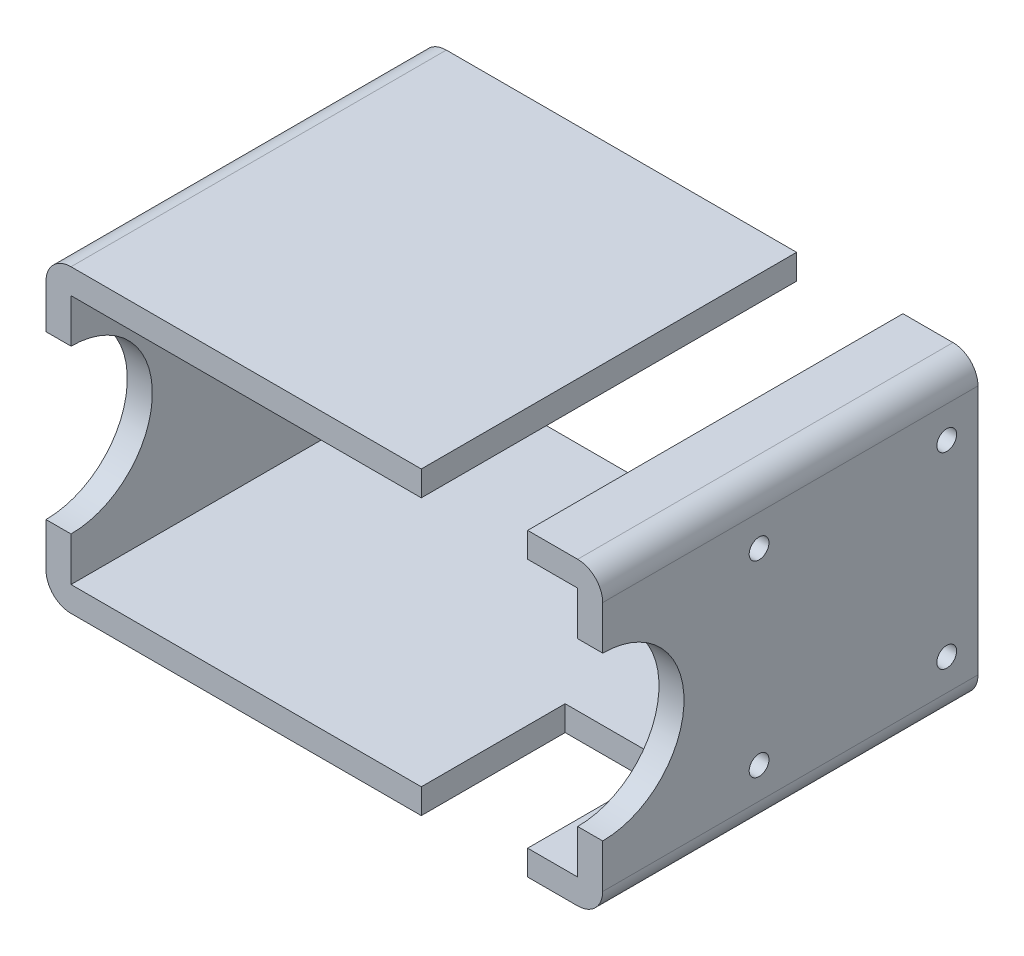
ISO-10303-21;
HEADER;
FILE_DESCRIPTION(('STEP AP214'),'2;1');
FILE_NAME('part.step','',(''),(''),'','','');
FILE_SCHEMA(('AUTOMOTIVE_DESIGN { 1 0 10303 214 1 1 1 1 }'));
ENDSEC;
DATA;
#1=APPLICATION_CONTEXT('core data for automotive mechanical design processes');
#2=APPLICATION_PROTOCOL_DEFINITION('international standard','automotive_design',2000,#1);
#3=PRODUCT_CONTEXT('',#1,'mechanical');
#4=PRODUCT('Part','Part','',(#3));
#5=PRODUCT_RELATED_PRODUCT_CATEGORY('part','',(#4));
#6=PRODUCT_DEFINITION_FORMATION('','',#4);
#7=PRODUCT_DEFINITION_CONTEXT('part definition',#1,'design');
#8=PRODUCT_DEFINITION('design','',#6,#7);
#9=PRODUCT_DEFINITION_SHAPE('','',#8);
#10=(LENGTH_UNIT() NAMED_UNIT(*) SI_UNIT(.MILLI.,.METRE.));
#11=(NAMED_UNIT(*) PLANE_ANGLE_UNIT() SI_UNIT($,.RADIAN.));
#12=(NAMED_UNIT(*) SI_UNIT($,.STERADIAN.) SOLID_ANGLE_UNIT());
#13=UNCERTAINTY_MEASURE_WITH_UNIT(LENGTH_MEASURE(1.E-05),#10,'distance_accuracy_value','');
#14=(GEOMETRIC_REPRESENTATION_CONTEXT(3) GLOBAL_UNCERTAINTY_ASSIGNED_CONTEXT((#13)) GLOBAL_UNIT_ASSIGNED_CONTEXT((#10,
#11,#12)) REPRESENTATION_CONTEXT('',''));
#15=CARTESIAN_POINT('',(0.,0.,0.));
#16=DIRECTION('',(0.,0.,1.));
#17=DIRECTION('',(1.,0.,0.));
#18=AXIS2_PLACEMENT_3D('',#15,#16,#17);
#19=CARTESIAN_POINT('',(40.5,20.,42.));
#20=DIRECTION('',(0.,1.,0.));
#21=DIRECTION('',(0.,0.,-1.));
#22=AXIS2_PLACEMENT_3D('',#19,#20,#21);
#23=PLANE('',#22);
#24=DIRECTION('',(0.,0.,-1.));
#25=VECTOR('',#24,1.);
#26=CARTESIAN_POINT('',(36.5,20.,42.));
#27=LINE('',#26,#25);
#28=CARTESIAN_POINT('',(36.5,20.,42.));
#29=VERTEX_POINT('',#28);
#30=CARTESIAN_POINT('',(36.5,20.,12.));
#31=VERTEX_POINT('',#30);
#32=EDGE_CURVE('E180',#29,#31,#27,.T.);
#33=ORIENTED_EDGE('',*,*,#32,.T.);
#34=DIRECTION('',(-1.,0.,0.));
#35=VECTOR('',#34,1.);
#36=CARTESIAN_POINT('',(40.5,20.,12.));
#37=LINE('',#36,#35);
#38=CARTESIAN_POINT('',(40.5,20.,12.));
#39=VERTEX_POINT('',#38);
#40=EDGE_CURVE('E183',#39,#31,#37,.T.);
#41=ORIENTED_EDGE('',*,*,#40,.F.);
#42=DIRECTION('',(0.,0.,-1.));
#43=VECTOR('',#42,1.);
#44=CARTESIAN_POINT('',(40.5,20.,42.));
#45=LINE('',#44,#43);
#46=CARTESIAN_POINT('',(40.5,20.,42.));
#47=VERTEX_POINT('',#46);
#48=EDGE_CURVE('E214',#47,#39,#45,.T.);
#49=ORIENTED_EDGE('',*,*,#48,.F.);
#50=DIRECTION('',(-1.,0.,0.));
#51=VECTOR('',#50,1.);
#52=CARTESIAN_POINT('',(40.5,20.,42.));
#53=LINE('',#52,#51);
#54=EDGE_CURVE('E185',#47,#29,#53,.T.);
#55=ORIENTED_EDGE('',*,*,#54,.T.);
#56=EDGE_LOOP('',(#33,#41,#49,#55));
#57=FACE_BOUND('',#56,.T.);
#58=ADVANCED_FACE('F17',(#57),#23,.F.);
#59=CARTESIAN_POINT('',(42.5,22.,42.));
#60=DIRECTION('',(0.,1.,0.));
#61=DIRECTION('',(0.,0.,-1.));
#62=AXIS2_PLACEMENT_3D('',#59,#60,#61);
#63=PLANE('',#62);
#64=DIRECTION('',(-1.,0.,0.));
#65=VECTOR('',#64,1.);
#66=CARTESIAN_POINT('',(42.5,22.,12.));
#67=LINE('',#66,#65);
#68=CARTESIAN_POINT('',(40.5,22.,12.));
#69=VERTEX_POINT('',#68);
#70=CARTESIAN_POINT('',(36.5,22.,12.));
#71=VERTEX_POINT('',#70);
#72=EDGE_CURVE('E300',#69,#71,#67,.T.);
#73=ORIENTED_EDGE('',*,*,#72,.T.);
#74=DIRECTION('',(0.,0.,-1.));
#75=VECTOR('',#74,1.);
#76=CARTESIAN_POINT('',(36.5,22.,42.));
#77=LINE('',#76,#75);
#78=CARTESIAN_POINT('',(36.5,22.,42.));
#79=VERTEX_POINT('',#78);
#80=EDGE_CURVE('E40',#79,#71,#77,.T.);
#81=ORIENTED_EDGE('',*,*,#80,.F.);
#82=DIRECTION('',(-1.,0.,0.));
#83=VECTOR('',#82,1.);
#84=CARTESIAN_POINT('',(42.5,22.,42.));
#85=LINE('',#84,#83);
#86=CARTESIAN_POINT('',(40.5,22.,42.));
#87=VERTEX_POINT('',#86);
#88=EDGE_CURVE('E268',#87,#79,#85,.T.);
#89=ORIENTED_EDGE('',*,*,#88,.F.);
#90=DIRECTION('',(0.,0.,-1.));
#91=VECTOR('',#90,1.);
#92=CARTESIAN_POINT('',(40.5,22.,42.));
#93=LINE('',#92,#91);
#94=EDGE_CURVE('E357',#87,#69,#93,.T.);
#95=ORIENTED_EDGE('',*,*,#94,.T.);
#96=EDGE_LOOP('',(#73,#81,#89,#95));
#97=FACE_BOUND('',#96,.T.);
#98=ADVANCED_FACE('F674',(#97),#63,.T.);
#99=CARTESIAN_POINT('',(0.,0.,12.));
#100=DIRECTION('',(0.,0.,-1.));
#101=DIRECTION('',(1.,0.,0.));
#102=AXIS2_PLACEMENT_3D('',#99,#100,#101);
#103=PLANE('',#102);
#104=CARTESIAN_POINT('',(28.,22.,12.));
#105=VERTEX_POINT('',#104);
#106=CARTESIAN_POINT('',(0.,22.,12.));
#107=VERTEX_POINT('',#106);
#108=EDGE_CURVE('E299',#105,#107,#67,.T.);
#109=ORIENTED_EDGE('',*,*,#108,.F.);
#110=DIRECTION('',(0.,-1.,0.));
#111=VECTOR('',#110,1.);
#112=CARTESIAN_POINT('',(28.,0.,12.));
#113=LINE('',#112,#111);
#114=CARTESIAN_POINT('',(28.,20.,12.));
#115=VERTEX_POINT('',#114);
#116=EDGE_CURVE('E11',#105,#115,#113,.T.);
#117=ORIENTED_EDGE('',*,*,#116,.T.);
#118=CARTESIAN_POINT('',(0.,20.,12.));
#119=VERTEX_POINT('',#118);
#120=EDGE_CURVE('E202',#115,#119,#37,.T.);
#121=ORIENTED_EDGE('',*,*,#120,.T.);
#122=DIRECTION('',(0.,-1.,0.));
#123=VECTOR('',#122,1.);
#124=CARTESIAN_POINT('',(0.,20.,12.));
#125=LINE('',#124,#123);
#126=CARTESIAN_POINT('',(0.,0.,12.));
#127=VERTEX_POINT('',#126);
#128=EDGE_CURVE('E211',#119,#127,#125,.T.);
#129=ORIENTED_EDGE('',*,*,#128,.T.);
#130=DIRECTION('',(1.,0.,0.));
#131=VECTOR('',#130,1.);
#132=CARTESIAN_POINT('',(0.,0.,12.));
#133=LINE('',#132,#131);
#134=CARTESIAN_POINT('',(40.5,0.,12.));
#135=VERTEX_POINT('',#134);
#136=EDGE_CURVE('E208',#127,#135,#133,.T.);
#137=ORIENTED_EDGE('',*,*,#136,.T.);
#138=DIRECTION('',(0.,1.,0.));
#139=VECTOR('',#138,1.);
#140=CARTESIAN_POINT('',(40.5,0.,12.));
#141=LINE('',#140,#139);
#142=EDGE_CURVE('E199',#135,#39,#141,.T.);
#143=ORIENTED_EDGE('',*,*,#142,.T.);
#144=ORIENTED_EDGE('',*,*,#40,.T.);
#145=DIRECTION('',(0.,1.,0.));
#146=VECTOR('',#145,1.);
#147=CARTESIAN_POINT('',(36.5,0.,12.));
#148=LINE('',#147,#146);
#149=EDGE_CURVE('E26',#31,#71,#148,.T.);
#150=ORIENTED_EDGE('',*,*,#149,.T.);
#151=ORIENTED_EDGE('',*,*,#72,.F.);
#152=CARTESIAN_POINT('',(40.5,20.,12.));
#153=DIRECTION('',(0.,0.,-1.));
#154=DIRECTION('',(-1.,0.,0.));
#155=AXIS2_PLACEMENT_3D('',#152,#153,#154);
#156=CIRCLE('',#155,2.);
#157=CARTESIAN_POINT('',(42.5,20.,12.));
#158=VERTEX_POINT('',#157);
#159=EDGE_CURVE('E344',#69,#158,#156,.T.);
#160=ORIENTED_EDGE('',*,*,#159,.T.);
#161=DIRECTION('',(0.,1.,0.));
#162=VECTOR('',#161,1.);
#163=CARTESIAN_POINT('',(42.5,-2.,12.));
#164=LINE('',#163,#162);
#165=CARTESIAN_POINT('',(42.5,0.,12.));
#166=VERTEX_POINT('',#165);
#167=EDGE_CURVE('E295',#166,#158,#164,.T.);
#168=ORIENTED_EDGE('',*,*,#167,.F.);
#169=CARTESIAN_POINT('',(40.5,0.,12.));
#170=DIRECTION('',(0.,0.,-1.));
#171=DIRECTION('',(-1.,0.,0.));
#172=AXIS2_PLACEMENT_3D('',#169,#170,#171);
#173=CIRCLE('',#172,2.);
#174=CARTESIAN_POINT('',(40.5,-2.,12.));
#175=VERTEX_POINT('',#174);
#176=EDGE_CURVE('E347',#166,#175,#173,.T.);
#177=ORIENTED_EDGE('',*,*,#176,.T.);
#178=DIRECTION('',(1.,0.,0.));
#179=VECTOR('',#178,1.);
#180=CARTESIAN_POINT('',(-2.,-2.,12.));
#181=LINE('',#180,#179);
#182=CARTESIAN_POINT('',(0.,-2.,12.));
#183=VERTEX_POINT('',#182);
#184=EDGE_CURVE('E290',#183,#175,#181,.T.);
#185=ORIENTED_EDGE('',*,*,#184,.F.);
#186=CARTESIAN_POINT('',(0.,0.,12.));
#187=DIRECTION('',(0.,0.,-1.));
#188=DIRECTION('',(-1.,0.,0.));
#189=AXIS2_PLACEMENT_3D('',#186,#187,#188);
#190=CIRCLE('',#189,2.);
#191=CARTESIAN_POINT('',(-2.,0.,12.));
#192=VERTEX_POINT('',#191);
#193=EDGE_CURVE('E350',#183,#192,#190,.T.);
#194=ORIENTED_EDGE('',*,*,#193,.T.);
#195=DIRECTION('',(0.,-1.,0.));
#196=VECTOR('',#195,1.);
#197=CARTESIAN_POINT('',(-2.,22.,12.));
#198=LINE('',#197,#196);
#199=CARTESIAN_POINT('',(-2.,20.,12.));
#200=VERTEX_POINT('',#199);
#201=EDGE_CURVE('E285',#200,#192,#198,.T.);
#202=ORIENTED_EDGE('',*,*,#201,.F.);
#203=CARTESIAN_POINT('',(0.,20.,12.));
#204=DIRECTION('',(0.,0.,-1.));
#205=DIRECTION('',(-1.,0.,0.));
#206=AXIS2_PLACEMENT_3D('',#203,#204,#205);
#207=CIRCLE('',#206,2.);
#208=EDGE_CURVE('E353',#200,#107,#207,.T.);
#209=ORIENTED_EDGE('',*,*,#208,.T.);
#210=EDGE_LOOP('',(#109,#117,#121,#129,#137,#143,#144,#150,#151,#160,#168,#177,#185,#194,#202,#209));
#211=FACE_BOUND('',#210,.T.);
#212=ADVANCED_FACE('F197',(#211),#103,.T.);
#213=CARTESIAN_POINT('',(0.,0.,42.));
#214=DIRECTION('',(0.,0.,-1.));
#215=DIRECTION('',(1.,0.,0.));
#216=AXIS2_PLACEMENT_3D('',#213,#214,#215);
#217=PLANE('',#216);
#218=DIRECTION('',(0.,1.,0.));
#219=VECTOR('',#218,1.);
#220=CARTESIAN_POINT('',(36.5,-2.2,42.));
#221=LINE('',#220,#219);
#222=CARTESIAN_POINT('',(36.5,-2.,42.));
#223=VERTEX_POINT('',#222);
#224=CARTESIAN_POINT('',(36.5,0.,42.));
#225=VERTEX_POINT('',#224);
#226=EDGE_CURVE('E603',#223,#225,#221,.T.);
#227=ORIENTED_EDGE('',*,*,#226,.F.);
#228=DIRECTION('',(1.,0.,0.));
#229=VECTOR('',#228,1.);
#230=CARTESIAN_POINT('',(-2.,-2.,42.));
#231=LINE('',#230,#229);
#232=CARTESIAN_POINT('',(40.5,-2.,42.));
#233=VERTEX_POINT('',#232);
#234=EDGE_CURVE('E320',#223,#233,#231,.T.);
#235=ORIENTED_EDGE('',*,*,#234,.T.);
#236=CARTESIAN_POINT('',(40.5,0.,42.));
#237=DIRECTION('',(0.,0.,-1.));
#238=DIRECTION('',(-1.,0.,0.));
#239=AXIS2_PLACEMENT_3D('',#236,#237,#238);
#240=CIRCLE('',#239,2.);
#241=CARTESIAN_POINT('',(42.5,0.,42.));
#242=VERTEX_POINT('',#241);
#243=EDGE_CURVE('E256',#233,#242,#240,.F.);
#244=ORIENTED_EDGE('',*,*,#243,.T.);
#245=DIRECTION('',(0.,1.,0.));
#246=VECTOR('',#245,1.);
#247=CARTESIAN_POINT('',(42.5,-2.,42.));
#248=LINE('',#247,#246);
#249=CARTESIAN_POINT('',(42.5,3.5,42.));
#250=VERTEX_POINT('',#249);
#251=EDGE_CURVE('E236',#242,#250,#248,.T.);
#252=ORIENTED_EDGE('',*,*,#251,.T.);
#253=DIRECTION('',(1.,0.,0.));
#254=VECTOR('',#253,1.);
#255=CARTESIAN_POINT('',(40.5,3.5,42.));
#256=LINE('',#255,#254);
#257=CARTESIAN_POINT('',(40.5,3.5,42.));
#258=VERTEX_POINT('',#257);
#259=EDGE_CURVE('E291',#258,#250,#256,.T.);
#260=ORIENTED_EDGE('',*,*,#259,.F.);
#261=DIRECTION('',(0.,1.,0.));
#262=VECTOR('',#261,1.);
#263=CARTESIAN_POINT('',(40.5,0.,42.));
#264=LINE('',#263,#262);
#265=CARTESIAN_POINT('',(40.5,0.,42.));
#266=VERTEX_POINT('',#265);
#267=EDGE_CURVE('E238',#266,#258,#264,.T.);
#268=ORIENTED_EDGE('',*,*,#267,.F.);
#269=DIRECTION('',(1.,0.,0.));
#270=VECTOR('',#269,1.);
#271=CARTESIAN_POINT('',(0.,0.,42.));
#272=LINE('',#271,#270);
#273=EDGE_CURVE('E530',#225,#266,#272,.T.);
#274=ORIENTED_EDGE('',*,*,#273,.F.);
#275=EDGE_LOOP('',(#227,#235,#244,#252,#260,#268,#274));
#276=FACE_BOUND('',#275,.T.);
#277=ADVANCED_FACE('F404',(#276),#217,.F.);
#278=DIRECTION('',(0.,-1.,0.));
#279=VECTOR('',#278,1.);
#280=CARTESIAN_POINT('',(28.,22.,42.));
#281=LINE('',#280,#279);
#282=CARTESIAN_POINT('',(28.,22.,42.));
#283=VERTEX_POINT('',#282);
#284=CARTESIAN_POINT('',(28.,20.,42.));
#285=VERTEX_POINT('',#284);
#286=EDGE_CURVE('E501',#283,#285,#281,.T.);
#287=ORIENTED_EDGE('',*,*,#286,.F.);
#288=CARTESIAN_POINT('',(0.,22.,42.));
#289=VERTEX_POINT('',#288);
#290=EDGE_CURVE('E253',#283,#289,#85,.T.);
#291=ORIENTED_EDGE('',*,*,#290,.T.);
#292=CARTESIAN_POINT('',(0.,20.,42.));
#293=DIRECTION('',(0.,0.,-1.));
#294=DIRECTION('',(-1.,0.,0.));
#295=AXIS2_PLACEMENT_3D('',#292,#293,#294);
#296=CIRCLE('',#295,2.);
#297=CARTESIAN_POINT('',(-2.,20.,42.));
#298=VERTEX_POINT('',#297);
#299=EDGE_CURVE('E368',#289,#298,#296,.F.);
#300=ORIENTED_EDGE('',*,*,#299,.T.);
#301=DIRECTION('',(0.,-1.,0.));
#302=VECTOR('',#301,1.);
#303=CARTESIAN_POINT('',(-2.,22.,42.));
#304=LINE('',#303,#302);
#305=CARTESIAN_POINT('',(-2.,16.5,42.));
#306=VERTEX_POINT('',#305);
#307=EDGE_CURVE('E311',#298,#306,#304,.T.);
#308=ORIENTED_EDGE('',*,*,#307,.T.);
#309=DIRECTION('',(1.,0.,0.));
#310=VECTOR('',#309,1.);
#311=CARTESIAN_POINT('',(-2.,16.5,42.));
#312=LINE('',#311,#310);
#313=CARTESIAN_POINT('',(0.,16.5,42.));
#314=VERTEX_POINT('',#313);
#315=EDGE_CURVE('E425',#306,#314,#312,.T.);
#316=ORIENTED_EDGE('',*,*,#315,.T.);
#317=DIRECTION('',(0.,-1.,0.));
#318=VECTOR('',#317,1.);
#319=CARTESIAN_POINT('',(0.,20.,42.));
#320=LINE('',#319,#318);
#321=CARTESIAN_POINT('',(0.,20.,42.));
#322=VERTEX_POINT('',#321);
#323=EDGE_CURVE('E327',#322,#314,#320,.T.);
#324=ORIENTED_EDGE('',*,*,#323,.F.);
#325=EDGE_CURVE('E279',#285,#322,#53,.T.);
#326=ORIENTED_EDGE('',*,*,#325,.F.);
#327=EDGE_LOOP('',(#287,#291,#300,#308,#316,#324,#326));
#328=FACE_BOUND('',#327,.T.);
#329=ADVANCED_FACE('F553',(#328),#217,.F.);
#330=CARTESIAN_POINT('',(0.,20.,42.));
#331=DIRECTION('',(-1.,0.,0.));
#332=DIRECTION('',(0.,0.,-1.));
#333=AXIS2_PLACEMENT_3D('',#330,#331,#332);
#334=PLANE('',#333);
#335=CARTESIAN_POINT('',(0.,10.,14.8));
#336=DIRECTION('',(1.,0.,0.));
#337=DIRECTION('',(0.,1.,0.));
#338=AXIS2_PLACEMENT_3D('',#335,#336,#337);
#339=CIRCLE('',#338,0.79);
#340=CARTESIAN_POINT('',(0.,10.79,14.8));
#341=VERTEX_POINT('',#340);
#342=EDGE_CURVE('E485',#341,#341,#339,.T.);
#343=ORIENTED_EDGE('',*,*,#342,.F.);
#344=EDGE_LOOP('',(#343));
#345=FACE_BOUND('',#344,.T.);
#346=CARTESIAN_POINT('',(0.,10.,42.));
#347=DIRECTION('',(1.,0.,0.));
#348=DIRECTION('',(0.,-1.,0.));
#349=AXIS2_PLACEMENT_3D('',#346,#347,#348);
#350=CIRCLE('',#349,6.5);
#351=CARTESIAN_POINT('',(0.,3.5,42.));
#352=VERTEX_POINT('',#351);
#353=EDGE_CURVE('E335',#352,#314,#350,.T.);
#354=ORIENTED_EDGE('',*,*,#353,.F.);
#355=CARTESIAN_POINT('',(0.,0.,42.));
#356=VERTEX_POINT('',#355);
#357=EDGE_CURVE('E272',#352,#356,#320,.T.);
#358=ORIENTED_EDGE('',*,*,#357,.T.);
#359=DIRECTION('',(0.,0.,-1.));
#360=VECTOR('',#359,1.);
#361=CARTESIAN_POINT('',(0.,0.,42.));
#362=LINE('',#361,#360);
#363=EDGE_CURVE('E222',#356,#127,#362,.T.);
#364=ORIENTED_EDGE('',*,*,#363,.T.);
#365=ORIENTED_EDGE('',*,*,#128,.F.);
#366=DIRECTION('',(0.,0.,-1.));
#367=VECTOR('',#366,1.);
#368=CARTESIAN_POINT('',(0.,20.,42.));
#369=LINE('',#368,#367);
#370=EDGE_CURVE('E217',#322,#119,#369,.T.);
#371=ORIENTED_EDGE('',*,*,#370,.F.);
#372=ORIENTED_EDGE('',*,*,#323,.T.);
#373=EDGE_LOOP('',(#354,#358,#364,#365,#371,#372));
#374=FACE_BOUND('',#373,.T.);
#375=CARTESIAN_POINT('',(0.,17.,21.8));
#376=DIRECTION('',(1.,0.,0.));
#377=DIRECTION('',(0.,1.,0.));
#378=AXIS2_PLACEMENT_3D('',#375,#376,#377);
#379=CIRCLE('',#378,0.79);
#380=CARTESIAN_POINT('',(0.,17.79,21.8));
#381=VERTEX_POINT('',#380);
#382=EDGE_CURVE('E477',#381,#381,#379,.T.);
#383=ORIENTED_EDGE('',*,*,#382,.F.);
#384=EDGE_LOOP('',(#383));
#385=FACE_BOUND('',#384,.T.);
#386=CARTESIAN_POINT('',(0.,3.,21.8));
#387=DIRECTION('',(1.,0.,0.));
#388=DIRECTION('',(0.,1.,0.));
#389=AXIS2_PLACEMENT_3D('',#386,#387,#388);
#390=CIRCLE('',#389,0.79);
#391=CARTESIAN_POINT('',(0.,3.79,21.8));
#392=VERTEX_POINT('',#391);
#393=EDGE_CURVE('E493',#392,#392,#390,.T.);
#394=ORIENTED_EDGE('',*,*,#393,.F.);
#395=EDGE_LOOP('',(#394));
#396=FACE_BOUND('',#395,.T.);
#397=ADVANCED_FACE('F554',(#345,#374,#385,#396),#334,.F.);
#398=CARTESIAN_POINT('',(-2.,22.,42.));
#399=DIRECTION('',(-1.,0.,0.));
#400=DIRECTION('',(0.,0.,-1.));
#401=AXIS2_PLACEMENT_3D('',#398,#399,#400);
#402=PLANE('',#401);
#403=CARTESIAN_POINT('',(-2.,10.,14.8));
#404=DIRECTION('',(1.,0.,0.));
#405=DIRECTION('',(0.,1.,0.));
#406=AXIS2_PLACEMENT_3D('',#403,#404,#405);
#407=CIRCLE('',#406,0.79);
#408=CARTESIAN_POINT('',(-2.,10.79,14.8));
#409=VERTEX_POINT('',#408);
#410=EDGE_CURVE('E489',#409,#409,#407,.T.);
#411=ORIENTED_EDGE('',*,*,#410,.T.);
#412=EDGE_LOOP('',(#411));
#413=FACE_BOUND('',#412,.T.);
#414=ORIENTED_EDGE('',*,*,#307,.F.);
#415=DIRECTION('',(0.,0.,-1.));
#416=VECTOR('',#415,1.);
#417=CARTESIAN_POINT('',(-2.,20.,42.));
#418=LINE('',#417,#416);
#419=EDGE_CURVE('E340',#298,#200,#418,.T.);
#420=ORIENTED_EDGE('',*,*,#419,.T.);
#421=ORIENTED_EDGE('',*,*,#201,.T.);
#422=DIRECTION('',(0.,0.,-1.));
#423=VECTOR('',#422,1.);
#424=CARTESIAN_POINT('',(-2.,0.,42.));
#425=LINE('',#424,#423);
#426=CARTESIAN_POINT('',(-2.,0.,42.));
#427=VERTEX_POINT('',#426);
#428=EDGE_CURVE('E230',#192,#427,#425,.F.);
#429=ORIENTED_EDGE('',*,*,#428,.T.);
#430=CARTESIAN_POINT('',(-2.,3.5,42.));
#431=VERTEX_POINT('',#430);
#432=EDGE_CURVE('E306',#431,#427,#304,.T.);
#433=ORIENTED_EDGE('',*,*,#432,.F.);
#434=CARTESIAN_POINT('',(-2.,10.,42.));
#435=DIRECTION('',(1.,0.,0.));
#436=DIRECTION('',(0.,-1.,0.));
#437=AXIS2_PLACEMENT_3D('',#434,#435,#436);
#438=CIRCLE('',#437,6.5);
#439=EDGE_CURVE('E439',#431,#306,#438,.T.);
#440=ORIENTED_EDGE('',*,*,#439,.T.);
#441=EDGE_LOOP('',(#414,#420,#421,#429,#433,#440));
#442=FACE_BOUND('',#441,.T.);
#443=CARTESIAN_POINT('',(-2.,17.,21.8));
#444=DIRECTION('',(1.,0.,0.));
#445=DIRECTION('',(0.,1.,0.));
#446=AXIS2_PLACEMENT_3D('',#443,#444,#445);
#447=CIRCLE('',#446,0.79);
#448=CARTESIAN_POINT('',(-2.,17.79,21.8));
#449=VERTEX_POINT('',#448);
#450=EDGE_CURVE('E481',#449,#449,#447,.T.);
#451=ORIENTED_EDGE('',*,*,#450,.T.);
#452=EDGE_LOOP('',(#451));
#453=FACE_BOUND('',#452,.T.);
#454=CARTESIAN_POINT('',(-2.,3.,21.8));
#455=DIRECTION('',(1.,0.,0.));
#456=DIRECTION('',(0.,1.,0.));
#457=AXIS2_PLACEMENT_3D('',#454,#455,#456);
#458=CIRCLE('',#457,0.79);
#459=CARTESIAN_POINT('',(-2.,3.79,21.8));
#460=VERTEX_POINT('',#459);
#461=EDGE_CURVE('E497',#460,#460,#458,.T.);
#462=ORIENTED_EDGE('',*,*,#461,.T.);
#463=EDGE_LOOP('',(#462));
#464=FACE_BOUND('',#463,.T.);
#465=ADVANCED_FACE('F569',(#413,#442,#453,#464),#402,.T.);
#466=ORIENTED_EDGE('',*,*,#88,.T.);
#467=DIRECTION('',(0.,-1.,0.));
#468=VECTOR('',#467,1.);
#469=CARTESIAN_POINT('',(36.5,22.,42.));
#470=LINE('',#469,#468);
#471=EDGE_CURVE('E513',#79,#29,#470,.T.);
#472=ORIENTED_EDGE('',*,*,#471,.T.);
#473=ORIENTED_EDGE('',*,*,#54,.F.);
#474=CARTESIAN_POINT('',(40.5,16.5,42.));
#475=VERTEX_POINT('',#474);
#476=EDGE_CURVE('E278',#475,#47,#264,.T.);
#477=ORIENTED_EDGE('',*,*,#476,.F.);
#478=DIRECTION('',(1.,0.,0.));
#479=VECTOR('',#478,1.);
#480=CARTESIAN_POINT('',(40.5,16.5,42.));
#481=LINE('',#480,#479);
#482=CARTESIAN_POINT('',(42.5,16.5,42.));
#483=VERTEX_POINT('',#482);
#484=EDGE_CURVE('E324',#483,#475,#481,.F.);
#485=ORIENTED_EDGE('',*,*,#484,.F.);
#486=CARTESIAN_POINT('',(42.5,20.,42.));
#487=VERTEX_POINT('',#486);
#488=EDGE_CURVE('E231',#483,#487,#248,.T.);
#489=ORIENTED_EDGE('',*,*,#488,.T.);
#490=CARTESIAN_POINT('',(40.5,20.,42.));
#491=DIRECTION('',(0.,0.,-1.));
#492=DIRECTION('',(-1.,0.,0.));
#493=AXIS2_PLACEMENT_3D('',#490,#491,#492);
#494=CIRCLE('',#493,2.);
#495=EDGE_CURVE('E365',#487,#87,#494,.F.);
#496=ORIENTED_EDGE('',*,*,#495,.T.);
#497=EDGE_LOOP('',(#466,#472,#473,#477,#485,#489,#496));
#498=FACE_BOUND('',#497,.T.);
#499=ADVANCED_FACE('F589',(#498),#217,.F.);
#500=CARTESIAN_POINT('',(0.,-2.,42.));
#501=VERTEX_POINT('',#500);
#502=CARTESIAN_POINT('',(28.,-2.,42.));
#503=VERTEX_POINT('',#502);
#504=EDGE_CURVE('E237',#501,#503,#231,.T.);
#505=ORIENTED_EDGE('',*,*,#504,.T.);
#506=DIRECTION('',(0.,1.,0.));
#507=VECTOR('',#506,1.);
#508=CARTESIAN_POINT('',(28.,-2.2,42.));
#509=LINE('',#508,#507);
#510=CARTESIAN_POINT('',(28.,0.,42.));
#511=VERTEX_POINT('',#510);
#512=EDGE_CURVE('E578',#503,#511,#509,.T.);
#513=ORIENTED_EDGE('',*,*,#512,.T.);
#514=EDGE_CURVE('E226',#356,#511,#272,.T.);
#515=ORIENTED_EDGE('',*,*,#514,.F.);
#516=ORIENTED_EDGE('',*,*,#357,.F.);
#517=DIRECTION('',(1.,0.,0.));
#518=VECTOR('',#517,1.);
#519=CARTESIAN_POINT('',(-2.,3.5,42.));
#520=LINE('',#519,#518);
#521=EDGE_CURVE('E430',#352,#431,#520,.F.);
#522=ORIENTED_EDGE('',*,*,#521,.T.);
#523=ORIENTED_EDGE('',*,*,#432,.T.);
#524=CARTESIAN_POINT('',(0.,0.,42.));
#525=DIRECTION('',(0.,0.,-1.));
#526=DIRECTION('',(-1.,0.,0.));
#527=AXIS2_PLACEMENT_3D('',#524,#525,#526);
#528=CIRCLE('',#527,2.);
#529=EDGE_CURVE('E259',#427,#501,#528,.F.);
#530=ORIENTED_EDGE('',*,*,#529,.T.);
#531=EDGE_LOOP('',(#505,#513,#515,#516,#522,#523,#530));
#532=FACE_BOUND('',#531,.T.);
#533=ADVANCED_FACE('F576',(#532),#217,.F.);
#534=CARTESIAN_POINT('',(40.5,0.,42.));
#535=DIRECTION('',(1.,0.,0.));
#536=DIRECTION('',(0.,0.,1.));
#537=AXIS2_PLACEMENT_3D('',#534,#535,#536);
#538=PLANE('',#537);
#539=CARTESIAN_POINT('',(40.5,17.5,29.5));
#540=DIRECTION('',(1.,0.,0.));
#541=DIRECTION('',(0.,-1.,0.));
#542=AXIS2_PLACEMENT_3D('',#539,#540,#541);
#543=CIRCLE('',#542,0.79);
#544=CARTESIAN_POINT('',(40.5,16.71,29.5));
#545=VERTEX_POINT('',#544);
#546=EDGE_CURVE('E469',#545,#545,#543,.T.);
#547=ORIENTED_EDGE('',*,*,#546,.T.);
#548=EDGE_LOOP('',(#547));
#549=FACE_BOUND('',#548,.T.);
#550=CARTESIAN_POINT('',(40.5,17.5,14.5));
#551=DIRECTION('',(1.,0.,0.));
#552=DIRECTION('',(0.,-1.,0.));
#553=AXIS2_PLACEMENT_3D('',#550,#551,#552);
#554=CIRCLE('',#553,0.79);
#555=CARTESIAN_POINT('',(40.5,16.71,14.5));
#556=VERTEX_POINT('',#555);
#557=EDGE_CURVE('E461',#556,#556,#554,.T.);
#558=ORIENTED_EDGE('',*,*,#557,.T.);
#559=EDGE_LOOP('',(#558));
#560=FACE_BOUND('',#559,.T.);
#561=CARTESIAN_POINT('',(40.5,2.5,14.5));
#562=DIRECTION('',(1.,0.,0.));
#563=DIRECTION('',(0.,-1.,0.));
#564=AXIS2_PLACEMENT_3D('',#561,#562,#563);
#565=CIRCLE('',#564,0.79);
#566=CARTESIAN_POINT('',(40.5,1.71,14.5));
#567=VERTEX_POINT('',#566);
#568=EDGE_CURVE('E453',#567,#567,#565,.T.);
#569=ORIENTED_EDGE('',*,*,#568,.T.);
#570=EDGE_LOOP('',(#569));
#571=FACE_BOUND('',#570,.T.);
#572=CARTESIAN_POINT('',(40.5,2.5,29.5));
#573=DIRECTION('',(1.,0.,0.));
#574=DIRECTION('',(0.,-1.,0.));
#575=AXIS2_PLACEMENT_3D('',#572,#573,#574);
#576=CIRCLE('',#575,0.79);
#577=CARTESIAN_POINT('',(40.5,1.71,29.5));
#578=VERTEX_POINT('',#577);
#579=EDGE_CURVE('E452',#578,#578,#576,.T.);
#580=ORIENTED_EDGE('',*,*,#579,.T.);
#581=EDGE_LOOP('',(#580));
#582=FACE_BOUND('',#581,.T.);
#583=CARTESIAN_POINT('',(40.5,10.,42.));
#584=DIRECTION('',(-1.,0.,0.));
#585=DIRECTION('',(0.,-1.,0.));
#586=AXIS2_PLACEMENT_3D('',#583,#584,#585);
#587=CIRCLE('',#586,6.5);
#588=EDGE_CURVE('E411',#475,#258,#587,.T.);
#589=ORIENTED_EDGE('',*,*,#588,.F.);
#590=ORIENTED_EDGE('',*,*,#476,.T.);
#591=ORIENTED_EDGE('',*,*,#48,.T.);
#592=ORIENTED_EDGE('',*,*,#142,.F.);
#593=DIRECTION('',(0.,0.,-1.));
#594=VECTOR('',#593,1.);
#595=CARTESIAN_POINT('',(40.5,0.,42.));
#596=LINE('',#595,#594);
#597=EDGE_CURVE('E218',#266,#135,#596,.T.);
#598=ORIENTED_EDGE('',*,*,#597,.F.);
#599=ORIENTED_EDGE('',*,*,#267,.T.);
#600=EDGE_LOOP('',(#589,#590,#591,#592,#598,#599));
#601=FACE_BOUND('',#600,.T.);
#602=ADVANCED_FACE('F586',(#549,#560,#571,#582,#601),#538,.F.);
#603=CARTESIAN_POINT('',(42.5,-2.,42.));
#604=DIRECTION('',(1.,0.,0.));
#605=DIRECTION('',(0.,0.,1.));
#606=AXIS2_PLACEMENT_3D('',#603,#604,#605);
#607=PLANE('',#606);
#608=CARTESIAN_POINT('',(42.5,17.5,29.5));
#609=DIRECTION('',(1.,0.,0.));
#610=DIRECTION('',(0.,-1.,0.));
#611=AXIS2_PLACEMENT_3D('',#608,#609,#610);
#612=CIRCLE('',#611,0.79);
#613=CARTESIAN_POINT('',(42.5,16.71,29.5));
#614=VERTEX_POINT('',#613);
#615=EDGE_CURVE('E473',#614,#614,#612,.T.);
#616=ORIENTED_EDGE('',*,*,#615,.F.);
#617=EDGE_LOOP('',(#616));
#618=FACE_BOUND('',#617,.T.);
#619=CARTESIAN_POINT('',(42.5,17.5,14.5));
#620=DIRECTION('',(1.,0.,0.));
#621=DIRECTION('',(0.,-1.,0.));
#622=AXIS2_PLACEMENT_3D('',#619,#620,#621);
#623=CIRCLE('',#622,0.79);
#624=CARTESIAN_POINT('',(42.5,16.71,14.5));
#625=VERTEX_POINT('',#624);
#626=EDGE_CURVE('E465',#625,#625,#623,.T.);
#627=ORIENTED_EDGE('',*,*,#626,.F.);
#628=EDGE_LOOP('',(#627));
#629=FACE_BOUND('',#628,.T.);
#630=CARTESIAN_POINT('',(42.5,2.5,14.5));
#631=DIRECTION('',(1.,0.,0.));
#632=DIRECTION('',(0.,-1.,0.));
#633=AXIS2_PLACEMENT_3D('',#630,#631,#632);
#634=CIRCLE('',#633,0.79);
#635=CARTESIAN_POINT('',(42.5,1.71,14.5));
#636=VERTEX_POINT('',#635);
#637=EDGE_CURVE('E457',#636,#636,#634,.T.);
#638=ORIENTED_EDGE('',*,*,#637,.F.);
#639=EDGE_LOOP('',(#638));
#640=FACE_BOUND('',#639,.T.);
#641=CARTESIAN_POINT('',(42.5,2.5,29.5));
#642=DIRECTION('',(1.,0.,0.));
#643=DIRECTION('',(0.,-1.,0.));
#644=AXIS2_PLACEMENT_3D('',#641,#642,#643);
#645=CIRCLE('',#644,0.79);
#646=CARTESIAN_POINT('',(42.5,1.71,29.5));
#647=VERTEX_POINT('',#646);
#648=EDGE_CURVE('E448',#647,#647,#645,.T.);
#649=ORIENTED_EDGE('',*,*,#648,.F.);
#650=EDGE_LOOP('',(#649));
#651=FACE_BOUND('',#650,.T.);
#652=ORIENTED_EDGE('',*,*,#251,.F.);
#653=DIRECTION('',(0.,0.,-1.));
#654=VECTOR('',#653,1.);
#655=CARTESIAN_POINT('',(42.5,0.,42.));
#656=LINE('',#655,#654);
#657=EDGE_CURVE('E195',#242,#166,#656,.T.);
#658=ORIENTED_EDGE('',*,*,#657,.T.);
#659=ORIENTED_EDGE('',*,*,#167,.T.);
#660=DIRECTION('',(0.,0.,-1.));
#661=VECTOR('',#660,1.);
#662=CARTESIAN_POINT('',(42.5,20.,42.));
#663=LINE('',#662,#661);
#664=EDGE_CURVE('E262',#158,#487,#663,.F.);
#665=ORIENTED_EDGE('',*,*,#664,.T.);
#666=ORIENTED_EDGE('',*,*,#488,.F.);
#667=CARTESIAN_POINT('',(42.5,10.,42.));
#668=DIRECTION('',(-1.,0.,0.));
#669=DIRECTION('',(0.,-1.,0.));
#670=AXIS2_PLACEMENT_3D('',#667,#668,#669);
#671=CIRCLE('',#670,6.5);
#672=EDGE_CURVE('E399',#483,#250,#671,.T.);
#673=ORIENTED_EDGE('',*,*,#672,.T.);
#674=EDGE_LOOP('',(#652,#658,#659,#665,#666,#673));
#675=FACE_BOUND('',#674,.T.);
#676=ADVANCED_FACE('F395',(#618,#629,#640,#651,#675),#607,.T.);
#677=ORIENTED_EDGE('',*,*,#120,.F.);
#678=DIRECTION('',(0.,0.,1.));
#679=VECTOR('',#678,1.);
#680=CARTESIAN_POINT('',(28.,20.,30.5));
#681=LINE('',#680,#679);
#682=EDGE_CURVE('E33',#115,#285,#681,.T.);
#683=ORIENTED_EDGE('',*,*,#682,.T.);
#684=ORIENTED_EDGE('',*,*,#325,.T.);
#685=ORIENTED_EDGE('',*,*,#370,.T.);
#686=EDGE_LOOP('',(#677,#683,#684,#685));
#687=FACE_BOUND('',#686,.T.);
#688=ADVANCED_FACE('F550',(#687),#23,.F.);
#689=CARTESIAN_POINT('',(-2.,-2.,42.));
#690=DIRECTION('',(0.,-1.,0.));
#691=DIRECTION('',(0.,0.,1.));
#692=AXIS2_PLACEMENT_3D('',#689,#690,#691);
#693=PLANE('',#692);
#694=DIRECTION('',(0.,0.,-1.));
#695=VECTOR('',#694,1.);
#696=CARTESIAN_POINT('',(28.,-2.,42.));
#697=LINE('',#696,#695);
#698=CARTESIAN_POINT('',(28.,-2.,30.5));
#699=VERTEX_POINT('',#698);
#700=EDGE_CURVE('E614',#503,#699,#697,.T.);
#701=ORIENTED_EDGE('',*,*,#700,.F.);
#702=ORIENTED_EDGE('',*,*,#504,.F.);
#703=DIRECTION('',(0.,0.,-1.));
#704=VECTOR('',#703,1.);
#705=CARTESIAN_POINT('',(0.,-2.,42.));
#706=LINE('',#705,#704);
#707=EDGE_CURVE('E254',#501,#183,#706,.T.);
#708=ORIENTED_EDGE('',*,*,#707,.T.);
#709=ORIENTED_EDGE('',*,*,#184,.T.);
#710=DIRECTION('',(0.,0.,-1.));
#711=VECTOR('',#710,1.);
#712=CARTESIAN_POINT('',(40.5,-2.,42.));
#713=LINE('',#712,#711);
#714=EDGE_CURVE('E370',#175,#233,#713,.F.);
#715=ORIENTED_EDGE('',*,*,#714,.T.);
#716=ORIENTED_EDGE('',*,*,#234,.F.);
#717=DIRECTION('',(0.,0.,1.));
#718=VECTOR('',#717,1.);
#719=CARTESIAN_POINT('',(36.5,-2.,30.5));
#720=LINE('',#719,#718);
#721=CARTESIAN_POINT('',(36.5,-2.,30.5));
#722=VERTEX_POINT('',#721);
#723=EDGE_CURVE('E597',#722,#223,#720,.T.);
#724=ORIENTED_EDGE('',*,*,#723,.F.);
#725=DIRECTION('',(1.,0.,0.));
#726=VECTOR('',#725,1.);
#727=CARTESIAN_POINT('',(28.,-2.,30.5));
#728=LINE('',#727,#726);
#729=EDGE_CURVE('E601',#699,#722,#728,.T.);
#730=ORIENTED_EDGE('',*,*,#729,.F.);
#731=EDGE_LOOP('',(#701,#702,#708,#709,#715,#716,#724,#730));
#732=FACE_BOUND('',#731,.T.);
#733=ADVANCED_FACE('F385',(#732),#693,.T.);
#734=DIRECTION('',(0.,0.,1.));
#735=VECTOR('',#734,1.);
#736=CARTESIAN_POINT('',(28.,22.,30.5));
#737=LINE('',#736,#735);
#738=EDGE_CURVE('E188',#105,#283,#737,.T.);
#739=ORIENTED_EDGE('',*,*,#738,.F.);
#740=ORIENTED_EDGE('',*,*,#108,.T.);
#741=DIRECTION('',(0.,0.,-1.));
#742=VECTOR('',#741,1.);
#743=CARTESIAN_POINT('',(0.,22.,42.));
#744=LINE('',#743,#742);
#745=EDGE_CURVE('E361',#107,#289,#744,.F.);
#746=ORIENTED_EDGE('',*,*,#745,.T.);
#747=ORIENTED_EDGE('',*,*,#290,.F.);
#748=EDGE_LOOP('',(#739,#740,#746,#747));
#749=FACE_BOUND('',#748,.T.);
#750=ADVANCED_FACE('F560',(#749),#63,.T.);
#751=CARTESIAN_POINT('',(0.,0.,42.));
#752=DIRECTION('',(0.,-1.,0.));
#753=DIRECTION('',(0.,0.,1.));
#754=AXIS2_PLACEMENT_3D('',#751,#752,#753);
#755=PLANE('',#754);
#756=ORIENTED_EDGE('',*,*,#514,.T.);
#757=DIRECTION('',(0.,0.,-1.));
#758=VECTOR('',#757,1.);
#759=CARTESIAN_POINT('',(28.,0.,42.));
#760=LINE('',#759,#758);
#761=CARTESIAN_POINT('',(28.,0.,30.5));
#762=VERTEX_POINT('',#761);
#763=EDGE_CURVE('E516',#511,#762,#760,.T.);
#764=ORIENTED_EDGE('',*,*,#763,.T.);
#765=DIRECTION('',(1.,0.,0.));
#766=VECTOR('',#765,1.);
#767=CARTESIAN_POINT('',(28.,0.,30.5));
#768=LINE('',#767,#766);
#769=CARTESIAN_POINT('',(36.5,0.,30.5));
#770=VERTEX_POINT('',#769);
#771=EDGE_CURVE('E620',#762,#770,#768,.T.);
#772=ORIENTED_EDGE('',*,*,#771,.T.);
#773=DIRECTION('',(0.,0.,1.));
#774=VECTOR('',#773,1.);
#775=CARTESIAN_POINT('',(36.5,0.,30.5));
#776=LINE('',#775,#774);
#777=EDGE_CURVE('E622',#770,#225,#776,.T.);
#778=ORIENTED_EDGE('',*,*,#777,.T.);
#779=ORIENTED_EDGE('',*,*,#273,.T.);
#780=ORIENTED_EDGE('',*,*,#597,.T.);
#781=ORIENTED_EDGE('',*,*,#136,.F.);
#782=ORIENTED_EDGE('',*,*,#363,.F.);
#783=EDGE_LOOP('',(#756,#764,#772,#778,#779,#780,#781,#782));
#784=FACE_BOUND('',#783,.T.);
#785=ADVANCED_FACE('F581',(#784),#755,.F.);
#786=CARTESIAN_POINT('',(40.5,10.,42.));
#787=DIRECTION('',(1.,0.,0.));
#788=DIRECTION('',(0.,0.,1.));
#789=AXIS2_PLACEMENT_3D('',#786,#787,#788);
#790=CYLINDRICAL_SURFACE('',#789,6.5);
#791=ORIENTED_EDGE('',*,*,#672,.F.);
#792=ORIENTED_EDGE('',*,*,#484,.T.);
#793=ORIENTED_EDGE('',*,*,#588,.T.);
#794=ORIENTED_EDGE('',*,*,#259,.T.);
#795=EDGE_LOOP('',(#791,#792,#793,#794));
#796=FACE_BOUND('',#795,.T.);
#797=ADVANCED_FACE('F408',(#796),#790,.F.);
#798=CARTESIAN_POINT('',(-2.,10.,42.));
#799=DIRECTION('',(1.,0.,0.));
#800=DIRECTION('',(0.,0.,1.));
#801=AXIS2_PLACEMENT_3D('',#798,#799,#800);
#802=CYLINDRICAL_SURFACE('',#801,6.5);
#803=ORIENTED_EDGE('',*,*,#353,.T.);
#804=ORIENTED_EDGE('',*,*,#315,.F.);
#805=ORIENTED_EDGE('',*,*,#439,.F.);
#806=ORIENTED_EDGE('',*,*,#521,.F.);
#807=EDGE_LOOP('',(#803,#804,#805,#806));
#808=FACE_BOUND('',#807,.T.);
#809=ADVANCED_FACE('F575',(#808),#802,.F.);
#810=CARTESIAN_POINT('',(40.5,2.5,29.5));
#811=DIRECTION('',(1.,0.,0.));
#812=DIRECTION('',(0.,0.,1.));
#813=AXIS2_PLACEMENT_3D('',#810,#811,#812);
#814=CYLINDRICAL_SURFACE('',#813,0.79);
#815=ORIENTED_EDGE('',*,*,#579,.F.);
#816=EDGE_LOOP('',(#815));
#817=FACE_BOUND('',#816,.T.);
#818=ORIENTED_EDGE('',*,*,#648,.T.);
#819=EDGE_LOOP('',(#818));
#820=FACE_BOUND('',#819,.T.);
#821=ADVANCED_FACE('F734',(#817,#820),#814,.F.);
#822=CARTESIAN_POINT('',(40.5,2.5,14.5));
#823=DIRECTION('',(1.,0.,0.));
#824=DIRECTION('',(0.,0.,1.));
#825=AXIS2_PLACEMENT_3D('',#822,#823,#824);
#826=CYLINDRICAL_SURFACE('',#825,0.79);
#827=ORIENTED_EDGE('',*,*,#568,.F.);
#828=EDGE_LOOP('',(#827));
#829=FACE_BOUND('',#828,.T.);
#830=ORIENTED_EDGE('',*,*,#637,.T.);
#831=EDGE_LOOP('',(#830));
#832=FACE_BOUND('',#831,.T.);
#833=ADVANCED_FACE('F730',(#829,#832),#826,.F.);
#834=CARTESIAN_POINT('',(40.5,17.5,14.5));
#835=DIRECTION('',(1.,0.,0.));
#836=DIRECTION('',(0.,0.,1.));
#837=AXIS2_PLACEMENT_3D('',#834,#835,#836);
#838=CYLINDRICAL_SURFACE('',#837,0.79);
#839=ORIENTED_EDGE('',*,*,#557,.F.);
#840=EDGE_LOOP('',(#839));
#841=FACE_BOUND('',#840,.T.);
#842=ORIENTED_EDGE('',*,*,#626,.T.);
#843=EDGE_LOOP('',(#842));
#844=FACE_BOUND('',#843,.T.);
#845=ADVANCED_FACE('F726',(#841,#844),#838,.F.);
#846=CARTESIAN_POINT('',(40.5,17.5,29.5));
#847=DIRECTION('',(1.,0.,0.));
#848=DIRECTION('',(0.,0.,1.));
#849=AXIS2_PLACEMENT_3D('',#846,#847,#848);
#850=CYLINDRICAL_SURFACE('',#849,0.79);
#851=ORIENTED_EDGE('',*,*,#546,.F.);
#852=EDGE_LOOP('',(#851));
#853=FACE_BOUND('',#852,.T.);
#854=ORIENTED_EDGE('',*,*,#615,.T.);
#855=EDGE_LOOP('',(#854));
#856=FACE_BOUND('',#855,.T.);
#857=ADVANCED_FACE('F719',(#853,#856),#850,.F.);
#858=CARTESIAN_POINT('',(0.,17.,21.8));
#859=DIRECTION('',(-1.,0.,0.));
#860=DIRECTION('',(0.,0.,-1.));
#861=AXIS2_PLACEMENT_3D('',#858,#859,#860);
#862=CYLINDRICAL_SURFACE('',#861,0.79);
#863=ORIENTED_EDGE('',*,*,#382,.T.);
#864=EDGE_LOOP('',(#863));
#865=FACE_BOUND('',#864,.T.);
#866=ORIENTED_EDGE('',*,*,#450,.F.);
#867=EDGE_LOOP('',(#866));
#868=FACE_BOUND('',#867,.T.);
#869=ADVANCED_FACE('F710',(#865,#868),#862,.F.);
#870=CARTESIAN_POINT('',(0.,10.,14.8));
#871=DIRECTION('',(-1.,0.,0.));
#872=DIRECTION('',(0.,0.,-1.));
#873=AXIS2_PLACEMENT_3D('',#870,#871,#872);
#874=CYLINDRICAL_SURFACE('',#873,0.79);
#875=ORIENTED_EDGE('',*,*,#342,.T.);
#876=EDGE_LOOP('',(#875));
#877=FACE_BOUND('',#876,.T.);
#878=ORIENTED_EDGE('',*,*,#410,.F.);
#879=EDGE_LOOP('',(#878));
#880=FACE_BOUND('',#879,.T.);
#881=ADVANCED_FACE('F708',(#877,#880),#874,.F.);
#882=CARTESIAN_POINT('',(0.,3.,21.8));
#883=DIRECTION('',(-1.,0.,0.));
#884=DIRECTION('',(0.,0.,-1.));
#885=AXIS2_PLACEMENT_3D('',#882,#883,#884);
#886=CYLINDRICAL_SURFACE('',#885,0.79);
#887=ORIENTED_EDGE('',*,*,#393,.T.);
#888=EDGE_LOOP('',(#887));
#889=FACE_BOUND('',#888,.T.);
#890=ORIENTED_EDGE('',*,*,#461,.F.);
#891=EDGE_LOOP('',(#890));
#892=FACE_BOUND('',#891,.T.);
#893=ADVANCED_FACE('F671',(#889,#892),#886,.F.);
#894=CARTESIAN_POINT('',(0.,20.,42.));
#895=DIRECTION('',(0.,0.,-1.));
#896=DIRECTION('',(-1.,0.,0.));
#897=AXIS2_PLACEMENT_3D('',#894,#895,#896);
#898=CYLINDRICAL_SURFACE('',#897,2.);
#899=ORIENTED_EDGE('',*,*,#299,.F.);
#900=ORIENTED_EDGE('',*,*,#745,.F.);
#901=ORIENTED_EDGE('',*,*,#208,.F.);
#902=ORIENTED_EDGE('',*,*,#419,.F.);
#903=EDGE_LOOP('',(#899,#900,#901,#902));
#904=FACE_BOUND('',#903,.T.);
#905=ADVANCED_FACE('F565',(#904),#898,.T.);
#906=CARTESIAN_POINT('',(0.,0.,42.));
#907=DIRECTION('',(0.,0.,-1.));
#908=DIRECTION('',(-1.,0.,0.));
#909=AXIS2_PLACEMENT_3D('',#906,#907,#908);
#910=CYLINDRICAL_SURFACE('',#909,2.);
#911=ORIENTED_EDGE('',*,*,#529,.F.);
#912=ORIENTED_EDGE('',*,*,#428,.F.);
#913=ORIENTED_EDGE('',*,*,#193,.F.);
#914=ORIENTED_EDGE('',*,*,#707,.F.);
#915=EDGE_LOOP('',(#911,#912,#913,#914));
#916=FACE_BOUND('',#915,.T.);
#917=ADVANCED_FACE('F663',(#916),#910,.T.);
#918=CARTESIAN_POINT('',(40.5,0.,42.));
#919=DIRECTION('',(0.,0.,-1.));
#920=DIRECTION('',(-1.,0.,0.));
#921=AXIS2_PLACEMENT_3D('',#918,#919,#920);
#922=CYLINDRICAL_SURFACE('',#921,2.);
#923=ORIENTED_EDGE('',*,*,#243,.F.);
#924=ORIENTED_EDGE('',*,*,#714,.F.);
#925=ORIENTED_EDGE('',*,*,#176,.F.);
#926=ORIENTED_EDGE('',*,*,#657,.F.);
#927=EDGE_LOOP('',(#923,#924,#925,#926));
#928=FACE_BOUND('',#927,.T.);
#929=ADVANCED_FACE('F392',(#928),#922,.T.);
#930=CARTESIAN_POINT('',(40.5,20.,42.));
#931=DIRECTION('',(0.,0.,-1.));
#932=DIRECTION('',(-1.,0.,0.));
#933=AXIS2_PLACEMENT_3D('',#930,#931,#932);
#934=CYLINDRICAL_SURFACE('',#933,2.);
#935=ORIENTED_EDGE('',*,*,#495,.F.);
#936=ORIENTED_EDGE('',*,*,#664,.F.);
#937=ORIENTED_EDGE('',*,*,#159,.F.);
#938=ORIENTED_EDGE('',*,*,#94,.F.);
#939=EDGE_LOOP('',(#935,#936,#937,#938));
#940=FACE_BOUND('',#939,.T.);
#941=ADVANCED_FACE('F19',(#940),#934,.T.);
#942=CARTESIAN_POINT('',(28.,22.,30.5));
#943=DIRECTION('',(-1.,0.,0.));
#944=DIRECTION('',(0.,0.,-1.));
#945=AXIS2_PLACEMENT_3D('',#942,#943,#944);
#946=PLANE('',#945);
#947=ORIENTED_EDGE('',*,*,#682,.F.);
#948=ORIENTED_EDGE('',*,*,#116,.F.);
#949=ORIENTED_EDGE('',*,*,#738,.T.);
#950=ORIENTED_EDGE('',*,*,#286,.T.);
#951=EDGE_LOOP('',(#947,#948,#949,#950));
#952=FACE_BOUND('',#951,.T.);
#953=ADVANCED_FACE('F557',(#952),#946,.F.);
#954=CARTESIAN_POINT('',(36.5,22.,42.));
#955=DIRECTION('',(1.,0.,0.));
#956=DIRECTION('',(0.,0.,1.));
#957=AXIS2_PLACEMENT_3D('',#954,#955,#956);
#958=PLANE('',#957);
#959=ORIENTED_EDGE('',*,*,#32,.F.);
#960=ORIENTED_EDGE('',*,*,#471,.F.);
#961=ORIENTED_EDGE('',*,*,#80,.T.);
#962=ORIENTED_EDGE('',*,*,#149,.F.);
#963=EDGE_LOOP('',(#959,#960,#961,#962));
#964=FACE_BOUND('',#963,.T.);
#965=ADVANCED_FACE('F190',(#964),#958,.F.);
#966=CARTESIAN_POINT('',(28.,-2.2,42.));
#967=DIRECTION('',(-1.,0.,0.));
#968=DIRECTION('',(0.,0.,-1.));
#969=AXIS2_PLACEMENT_3D('',#966,#967,#968);
#970=PLANE('',#969);
#971=ORIENTED_EDGE('',*,*,#512,.F.);
#972=ORIENTED_EDGE('',*,*,#700,.T.);
#973=DIRECTION('',(0.,1.,0.));
#974=VECTOR('',#973,1.);
#975=CARTESIAN_POINT('',(28.,-2.2,30.5));
#976=LINE('',#975,#974);
#977=EDGE_CURVE('E600',#762,#699,#976,.F.);
#978=ORIENTED_EDGE('',*,*,#977,.F.);
#979=ORIENTED_EDGE('',*,*,#763,.F.);
#980=EDGE_LOOP('',(#971,#972,#978,#979));
#981=FACE_BOUND('',#980,.T.);
#982=ADVANCED_FACE('F1007',(#981),#970,.F.);
#983=CARTESIAN_POINT('',(28.,-2.2,30.5));
#984=DIRECTION('',(0.,0.,-1.));
#985=DIRECTION('',(1.,0.,0.));
#986=AXIS2_PLACEMENT_3D('',#983,#984,#985);
#987=PLANE('',#986);
#988=ORIENTED_EDGE('',*,*,#977,.T.);
#989=ORIENTED_EDGE('',*,*,#729,.T.);
#990=DIRECTION('',(0.,1.,0.));
#991=VECTOR('',#990,1.);
#992=CARTESIAN_POINT('',(36.5,-2.2,30.5));
#993=LINE('',#992,#991);
#994=EDGE_CURVE('E606',#770,#722,#993,.F.);
#995=ORIENTED_EDGE('',*,*,#994,.F.);
#996=ORIENTED_EDGE('',*,*,#771,.F.);
#997=EDGE_LOOP('',(#988,#989,#995,#996));
#998=FACE_BOUND('',#997,.T.);
#999=ADVANCED_FACE('F1016',(#998),#987,.F.);
#1000=CARTESIAN_POINT('',(36.5,-2.2,30.5));
#1001=DIRECTION('',(1.,0.,0.));
#1002=DIRECTION('',(0.,0.,1.));
#1003=AXIS2_PLACEMENT_3D('',#1000,#1001,#1002);
#1004=PLANE('',#1003);
#1005=ORIENTED_EDGE('',*,*,#994,.T.);
#1006=ORIENTED_EDGE('',*,*,#723,.T.);
#1007=ORIENTED_EDGE('',*,*,#226,.T.);
#1008=ORIENTED_EDGE('',*,*,#777,.F.);
#1009=EDGE_LOOP('',(#1005,#1006,#1007,#1008));
#1010=FACE_BOUND('',#1009,.T.);
#1011=ADVANCED_FACE('F1027',(#1010),#1004,.F.);
#1012=CLOSED_SHELL('',(#58,#98,#212,#277,#329,#397,#465,#499,#533,#602,#676,#688,#733,#750,#785,
#797,#809,#821,#833,#845,#857,#869,#881,#893,#905,#917,#929,#941,#953,#965,#982,#999,#1011));
#1013=MANIFOLD_SOLID_BREP('B1',#1012);
#1014=ADVANCED_BREP_SHAPE_REPRESENTATION('',(#18,#1013),#14);
#1015=SHAPE_DEFINITION_REPRESENTATION(#9,#1014);
ENDSEC;
END-ISO-10303-21;
